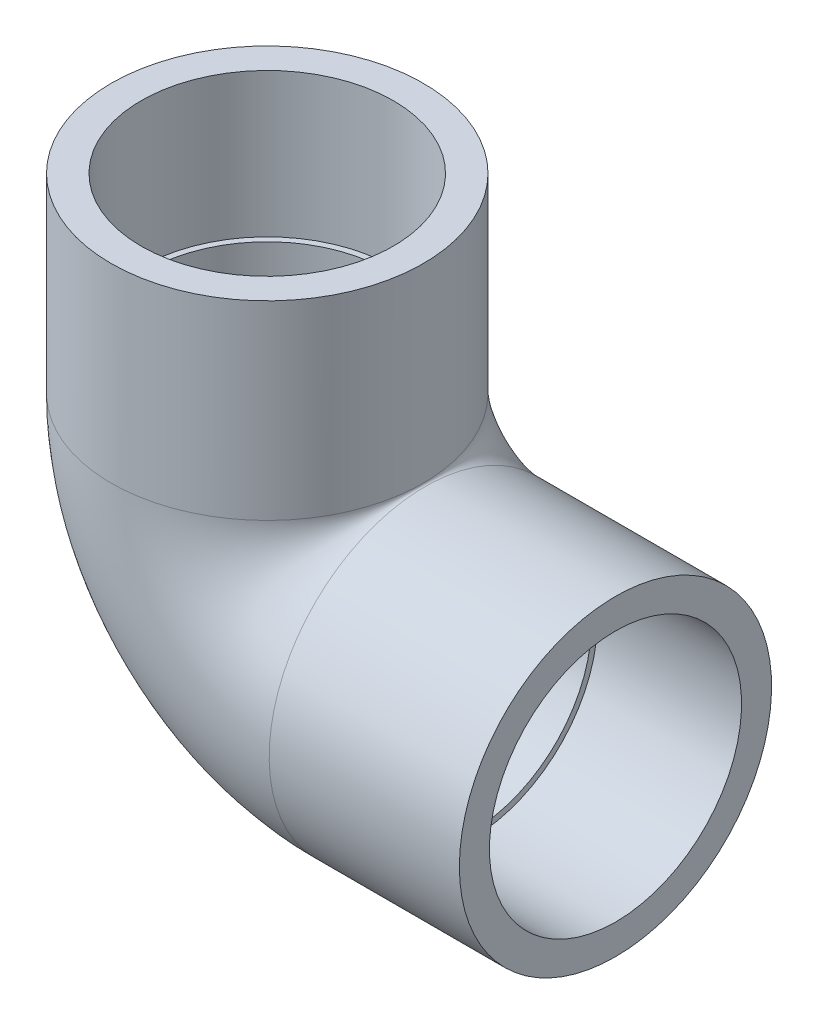
ISO-10303-21;
HEADER;
FILE_DESCRIPTION(('STEP AP214'),'2;1');
FILE_NAME('part.step','',(''),(''),'','','');
FILE_SCHEMA(('AUTOMOTIVE_DESIGN { 1 0 10303 214 1 1 1 1 }'));
ENDSEC;
DATA;
#1=APPLICATION_CONTEXT('core data for automotive mechanical design processes');
#2=APPLICATION_PROTOCOL_DEFINITION('international standard','automotive_design',2000,#1);
#3=PRODUCT_CONTEXT('',#1,'mechanical');
#4=PRODUCT('Part','Part','',(#3));
#5=PRODUCT_RELATED_PRODUCT_CATEGORY('part','',(#4));
#6=PRODUCT_DEFINITION_FORMATION('','',#4);
#7=PRODUCT_DEFINITION_CONTEXT('part definition',#1,'design');
#8=PRODUCT_DEFINITION('design','',#6,#7);
#9=PRODUCT_DEFINITION_SHAPE('','',#8);
#10=(LENGTH_UNIT() NAMED_UNIT(*) SI_UNIT(.MILLI.,.METRE.));
#11=(NAMED_UNIT(*) PLANE_ANGLE_UNIT() SI_UNIT($,.RADIAN.));
#12=(NAMED_UNIT(*) SI_UNIT($,.STERADIAN.) SOLID_ANGLE_UNIT());
#13=UNCERTAINTY_MEASURE_WITH_UNIT(LENGTH_MEASURE(1.E-05),#10,'distance_accuracy_value','');
#14=(GEOMETRIC_REPRESENTATION_CONTEXT(3) GLOBAL_UNCERTAINTY_ASSIGNED_CONTEXT((#13)) GLOBAL_UNIT_ASSIGNED_CONTEXT((#10,
#11,#12)) REPRESENTATION_CONTEXT('',''));
#15=CARTESIAN_POINT('',(0.,0.,0.));
#16=DIRECTION('',(0.,0.,1.));
#17=DIRECTION('',(1.,0.,0.));
#18=AXIS2_PLACEMENT_3D('',#15,#16,#17);
#19=CARTESIAN_POINT('',(0.,-25.146,0.));
#20=DIRECTION('',(0.,1.,0.));
#21=DIRECTION('',(-1.,0.,0.));
#22=AXIS2_PLACEMENT_3D('',#19,#20,#21);
#23=CYLINDRICAL_SURFACE('',#22,15.875);
#24=CARTESIAN_POINT('',(0.,-25.146,0.));
#25=DIRECTION('',(0.,1.,0.));
#26=DIRECTION('',(0.,0.,1.));
#27=AXIS2_PLACEMENT_3D('',#24,#25,#26);
#28=CIRCLE('',#27,15.875);
#29=CARTESIAN_POINT('',(-15.875,-25.146,0.));
#30=VERTEX_POINT('',#29);
#31=EDGE_CURVE('E56',#30,#30,#28,.T.);
#32=ORIENTED_EDGE('',*,*,#31,.F.);
#33=EDGE_LOOP('',(#32));
#34=FACE_BOUND('',#33,.T.);
#35=CARTESIAN_POINT('',(0.,-19.05,0.));
#36=DIRECTION('',(0.,1.,0.));
#37=DIRECTION('',(0.,0.,1.));
#38=AXIS2_PLACEMENT_3D('',#35,#36,#37);
#39=CIRCLE('',#38,15.875);
#40=CARTESIAN_POINT('',(0.,-19.05,15.875));
#41=VERTEX_POINT('',#40);
#42=EDGE_CURVE('E37',#41,#41,#39,.F.);
#43=ORIENTED_EDGE('',*,*,#42,.F.);
#44=EDGE_LOOP('',(#43));
#45=FACE_BOUND('',#44,.T.);
#46=ADVANCED_FACE('F33',(#34,#45),#23,.F.);
#47=CARTESIAN_POINT('',(20.8915,-46.0375,0.));
#48=DIRECTION('',(1.,0.,0.));
#49=DIRECTION('',(0.,0.,-1.));
#50=AXIS2_PLACEMENT_3D('',#47,#48,#49);
#51=CYLINDRICAL_SURFACE('',#50,15.875);
#52=CARTESIAN_POINT('',(20.8915,-46.0375,0.));
#53=DIRECTION('',(-1.,0.,0.));
#54=DIRECTION('',(0.,0.,1.));
#55=AXIS2_PLACEMENT_3D('',#52,#53,#54);
#56=CIRCLE('',#55,15.875);
#57=CARTESIAN_POINT('',(20.8915,-61.9125,0.));
#58=VERTEX_POINT('',#57);
#59=EDGE_CURVE('E46',#58,#58,#56,.T.);
#60=ORIENTED_EDGE('',*,*,#59,.T.);
#61=EDGE_LOOP('',(#60));
#62=FACE_BOUND('',#61,.T.);
#63=CARTESIAN_POINT('',(26.9875,-46.0375,0.));
#64=DIRECTION('',(1.,0.,0.));
#65=DIRECTION('',(0.,1.,0.));
#66=AXIS2_PLACEMENT_3D('',#63,#64,#65);
#67=CIRCLE('',#66,15.875);
#68=CARTESIAN_POINT('',(26.9875,-30.1625,0.));
#69=VERTEX_POINT('',#68);
#70=EDGE_CURVE('E49',#69,#69,#67,.T.);
#71=ORIENTED_EDGE('',*,*,#70,.T.);
#72=EDGE_LOOP('',(#71));
#73=FACE_BOUND('',#72,.T.);
#74=ADVANCED_FACE('F76',(#62,#73),#51,.F.);
#75=CARTESIAN_POINT('',(20.8915,-46.0375,0.));
#76=DIRECTION('',(1.,0.,0.));
#77=DIRECTION('',(0.,0.,-1.));
#78=AXIS2_PLACEMENT_3D('',#75,#76,#77);
#79=CYLINDRICAL_SURFACE('',#78,20.6375);
#80=CARTESIAN_POINT('',(20.8915,-46.0375,0.));
#81=DIRECTION('',(-1.,0.,0.));
#82=DIRECTION('',(0.,0.,1.));
#83=AXIS2_PLACEMENT_3D('',#80,#81,#82);
#84=CIRCLE('',#83,20.6375);
#85=CARTESIAN_POINT('',(20.8915,-66.675,0.));
#86=VERTEX_POINT('',#85);
#87=EDGE_CURVE('E41',#86,#86,#84,.T.);
#88=ORIENTED_EDGE('',*,*,#87,.F.);
#89=EDGE_LOOP('',(#88));
#90=FACE_BOUND('',#89,.T.);
#91=CARTESIAN_POINT('',(46.0375,-46.0375,0.));
#92=DIRECTION('',(-1.,0.,0.));
#93=DIRECTION('',(0.,0.,1.));
#94=AXIS2_PLACEMENT_3D('',#91,#92,#93);
#95=CIRCLE('',#94,20.6375);
#96=CARTESIAN_POINT('',(46.0375,-46.0375,20.6375));
#97=VERTEX_POINT('',#96);
#98=EDGE_CURVE('E10',#97,#97,#95,.T.);
#99=ORIENTED_EDGE('',*,*,#98,.T.);
#100=EDGE_LOOP('',(#99));
#101=FACE_BOUND('',#100,.T.);
#102=ADVANCED_FACE('F35',(#90,#101),#79,.T.);
#103=CARTESIAN_POINT('',(20.8915,-25.146,0.));
#104=DIRECTION('',(0.,0.,1.));
#105=DIRECTION('',(1.,0.,0.));
#106=AXIS2_PLACEMENT_3D('',#103,#104,#105);
#107=TOROIDAL_SURFACE('',#106,20.8915,20.6375);
#108=CARTESIAN_POINT('',(0.,-25.146,0.));
#109=DIRECTION('',(0.,1.,0.));
#110=DIRECTION('',(0.,0.,1.));
#111=AXIS2_PLACEMENT_3D('',#108,#109,#110);
#112=CIRCLE('',#111,20.6375);
#113=CARTESIAN_POINT('',(-20.6375,-25.146,0.));
#114=VERTEX_POINT('',#113);
#115=EDGE_CURVE('E71',#114,#114,#112,.T.);
#116=CARTESIAN_POINT('',(20.8915,-25.146,0.));
#117=DIRECTION('',(0.,0.,1.));
#118=DIRECTION('',(1.,0.,0.));
#119=AXIS2_PLACEMENT_3D('',#116,#117,#118);
#120=CIRCLE('',#119,41.529);
#121=EDGE_CURVE('',#114,#86,#120,.T.);
#122=ORIENTED_EDGE('',*,*,#115,.F.);
#123=ORIENTED_EDGE('',*,*,#87,.T.);
#124=ORIENTED_EDGE('',*,*,#121,.T.);
#125=ORIENTED_EDGE('',*,*,#121,.F.);
#126=EDGE_LOOP('',(#122,#124,#123,#125));
#127=FACE_BOUND('',#126,.T.);
#128=ADVANCED_FACE('F81',(#127),#107,.T.);
#129=CARTESIAN_POINT('',(20.8915,-25.146,0.));
#130=DIRECTION('',(0.,0.,1.));
#131=DIRECTION('',(1.,0.,0.));
#132=AXIS2_PLACEMENT_3D('',#129,#130,#131);
#133=TOROIDAL_SURFACE('',#132,20.8915,15.875);
#134=CARTESIAN_POINT('',(20.8915,-25.146,0.));
#135=DIRECTION('',(0.,0.,1.));
#136=DIRECTION('',(1.,0.,0.));
#137=AXIS2_PLACEMENT_3D('',#134,#135,#136);
#138=CIRCLE('',#137,36.7665);
#139=EDGE_CURVE('',#30,#58,#138,.T.);
#140=ORIENTED_EDGE('',*,*,#31,.T.);
#141=ORIENTED_EDGE('',*,*,#59,.F.);
#142=ORIENTED_EDGE('',*,*,#139,.T.);
#143=ORIENTED_EDGE('',*,*,#139,.F.);
#144=EDGE_LOOP('',(#140,#142,#141,#143));
#145=FACE_BOUND('',#144,.T.);
#146=ADVANCED_FACE('F78',(#145),#133,.F.);
#147=CARTESIAN_POINT('',(0.,-25.146,0.));
#148=DIRECTION('',(0.,1.,0.));
#149=DIRECTION('',(-1.,0.,0.));
#150=AXIS2_PLACEMENT_3D('',#147,#148,#149);
#151=CYLINDRICAL_SURFACE('',#150,20.6375);
#152=ORIENTED_EDGE('',*,*,#115,.T.);
#153=EDGE_LOOP('',(#152));
#154=FACE_BOUND('',#153,.T.);
#155=CARTESIAN_POINT('',(0.,0.,0.));
#156=DIRECTION('',(0.,1.,0.));
#157=DIRECTION('',(0.,0.,1.));
#158=AXIS2_PLACEMENT_3D('',#155,#156,#157);
#159=CIRCLE('',#158,20.6375);
#160=CARTESIAN_POINT('',(0.,0.,20.6375));
#161=VERTEX_POINT('',#160);
#162=EDGE_CURVE('E51',#161,#161,#159,.T.);
#163=ORIENTED_EDGE('',*,*,#162,.F.);
#164=EDGE_LOOP('',(#163));
#165=FACE_BOUND('',#164,.T.);
#166=ADVANCED_FACE('F80',(#154,#165),#151,.T.);
#167=CARTESIAN_POINT('',(46.0375,-46.0375,0.));
#168=DIRECTION('',(-1.,0.,0.));
#169=DIRECTION('',(0.,0.,1.));
#170=AXIS2_PLACEMENT_3D('',#167,#168,#169);
#171=PLANE('',#170);
#172=CARTESIAN_POINT('',(46.0375,-46.0375,0.));
#173=DIRECTION('',(1.,0.,0.));
#174=DIRECTION('',(0.,1.,0.));
#175=AXIS2_PLACEMENT_3D('',#172,#173,#174);
#176=CIRCLE('',#175,16.66875);
#177=CARTESIAN_POINT('',(46.0375,-29.36875,0.));
#178=VERTEX_POINT('',#177);
#179=EDGE_CURVE('E59',#178,#178,#176,.T.);
#180=ORIENTED_EDGE('',*,*,#179,.F.);
#181=EDGE_LOOP('',(#180));
#182=FACE_BOUND('',#181,.T.);
#183=ORIENTED_EDGE('',*,*,#98,.F.);
#184=EDGE_LOOP('',(#183));
#185=FACE_BOUND('',#184,.T.);
#186=ADVANCED_FACE('F88',(#182,#185),#171,.F.);
#187=CARTESIAN_POINT('',(0.,0.,0.));
#188=DIRECTION('',(0.,1.,0.));
#189=DIRECTION('',(0.,0.,1.));
#190=AXIS2_PLACEMENT_3D('',#187,#188,#189);
#191=PLANE('',#190);
#192=CARTESIAN_POINT('',(0.,0.,0.));
#193=DIRECTION('',(0.,1.,0.));
#194=DIRECTION('',(0.,0.,1.));
#195=AXIS2_PLACEMENT_3D('',#192,#193,#194);
#196=CIRCLE('',#195,16.66875);
#197=CARTESIAN_POINT('',(0.,0.,16.66875));
#198=VERTEX_POINT('',#197);
#199=EDGE_CURVE('E66',#198,#198,#196,.T.);
#200=ORIENTED_EDGE('',*,*,#199,.F.);
#201=EDGE_LOOP('',(#200));
#202=FACE_BOUND('',#201,.T.);
#203=ORIENTED_EDGE('',*,*,#162,.T.);
#204=EDGE_LOOP('',(#203));
#205=FACE_BOUND('',#204,.T.);
#206=ADVANCED_FACE('F102',(#202,#205),#191,.T.);
#207=CARTESIAN_POINT('',(26.9875,-46.0375,0.));
#208=DIRECTION('',(1.,0.,0.));
#209=DIRECTION('',(0.,1.,0.));
#210=AXIS2_PLACEMENT_3D('',#207,#208,#209);
#211=CYLINDRICAL_SURFACE('',#210,16.66875);
#212=CARTESIAN_POINT('',(26.9875,-46.0375,0.));
#213=DIRECTION('',(1.,0.,0.));
#214=DIRECTION('',(0.,1.,0.));
#215=AXIS2_PLACEMENT_3D('',#212,#213,#214);
#216=CIRCLE('',#215,16.66875);
#217=CARTESIAN_POINT('',(26.9875,-29.36875,0.));
#218=VERTEX_POINT('',#217);
#219=EDGE_CURVE('E52',#218,#218,#216,.T.);
#220=CARTESIAN_POINT('',(26.9875,-29.36875,0.));
#221=CARTESIAN_POINT('',(27.1859375,-29.36875,0.));
#222=CARTESIAN_POINT('',(27.384375,-29.36875,0.));
#223=CARTESIAN_POINT('',(27.78125,-29.36875,0.));
#224=CARTESIAN_POINT('',(27.9796875,-29.36875,0.));
#225=CARTESIAN_POINT('',(28.3765625,-29.36875,0.));
#226=CARTESIAN_POINT('',(28.575,-29.36875,0.));
#227=CARTESIAN_POINT('',(28.971875,-29.36875,0.));
#228=CARTESIAN_POINT('',(29.1703125,-29.36875,0.));
#229=CARTESIAN_POINT('',(29.5671875,-29.36875,0.));
#230=CARTESIAN_POINT('',(29.765625,-29.36875,0.));
#231=CARTESIAN_POINT('',(30.1625,-29.36875,0.));
#232=CARTESIAN_POINT('',(30.3609375,-29.36875,0.));
#233=CARTESIAN_POINT('',(30.7578125,-29.36875,0.));
#234=CARTESIAN_POINT('',(30.95625,-29.36875,0.));
#235=CARTESIAN_POINT('',(31.353125,-29.36875,0.));
#236=CARTESIAN_POINT('',(31.5515625,-29.36875,0.));
#237=CARTESIAN_POINT('',(31.9484375,-29.36875,0.));
#238=CARTESIAN_POINT('',(32.146875,-29.36875,0.));
#239=CARTESIAN_POINT('',(32.54375,-29.36875,0.));
#240=CARTESIAN_POINT('',(32.7421875,-29.36875,0.));
#241=CARTESIAN_POINT('',(33.1390625,-29.36875,0.));
#242=CARTESIAN_POINT('',(33.3375,-29.36875,0.));
#243=CARTESIAN_POINT('',(33.734375,-29.36875,0.));
#244=CARTESIAN_POINT('',(33.9328125,-29.36875,0.));
#245=CARTESIAN_POINT('',(34.3296875,-29.36875,0.));
#246=CARTESIAN_POINT('',(34.528125,-29.36875,0.));
#247=CARTESIAN_POINT('',(34.925,-29.36875,0.));
#248=CARTESIAN_POINT('',(35.1234375,-29.36875,0.));
#249=CARTESIAN_POINT('',(35.5203125,-29.36875,0.));
#250=CARTESIAN_POINT('',(35.71875,-29.36875,0.));
#251=CARTESIAN_POINT('',(36.115625,-29.36875,0.));
#252=CARTESIAN_POINT('',(36.3140625,-29.36875,0.));
#253=CARTESIAN_POINT('',(36.7109375,-29.36875,0.));
#254=CARTESIAN_POINT('',(36.909375,-29.36875,0.));
#255=CARTESIAN_POINT('',(37.30625,-29.36875,0.));
#256=CARTESIAN_POINT('',(37.5046875,-29.36875,0.));
#257=CARTESIAN_POINT('',(37.9015625,-29.36875,0.));
#258=CARTESIAN_POINT('',(38.1,-29.36875,0.));
#259=CARTESIAN_POINT('',(38.496875,-29.36875,0.));
#260=CARTESIAN_POINT('',(38.6953125,-29.36875,0.));
#261=CARTESIAN_POINT('',(39.0921875,-29.36875,0.));
#262=CARTESIAN_POINT('',(39.290625,-29.36875,0.));
#263=CARTESIAN_POINT('',(39.6875,-29.36875,0.));
#264=CARTESIAN_POINT('',(39.8859375,-29.36875,0.));
#265=CARTESIAN_POINT('',(40.2828125,-29.36875,0.));
#266=CARTESIAN_POINT('',(40.48125,-29.36875,0.));
#267=CARTESIAN_POINT('',(40.878125,-29.36875,0.));
#268=CARTESIAN_POINT('',(41.0765625,-29.36875,0.));
#269=CARTESIAN_POINT('',(41.4734375,-29.36875,0.));
#270=CARTESIAN_POINT('',(41.671875,-29.36875,0.));
#271=CARTESIAN_POINT('',(42.06875,-29.36875,0.));
#272=CARTESIAN_POINT('',(42.2671875,-29.36875,0.));
#273=CARTESIAN_POINT('',(42.6640625,-29.36875,0.));
#274=CARTESIAN_POINT('',(42.8625,-29.36875,0.));
#275=CARTESIAN_POINT('',(43.259375,-29.36875,0.));
#276=CARTESIAN_POINT('',(43.4578125,-29.36875,0.));
#277=CARTESIAN_POINT('',(43.8546875,-29.36875,0.));
#278=CARTESIAN_POINT('',(44.053125,-29.36875,0.));
#279=CARTESIAN_POINT('',(44.45,-29.36875,0.));
#280=CARTESIAN_POINT('',(44.6484375,-29.36875,0.));
#281=CARTESIAN_POINT('',(45.0453125,-29.36875,0.));
#282=CARTESIAN_POINT('',(45.24375,-29.36875,0.));
#283=CARTESIAN_POINT('',(45.640625,-29.36875,0.));
#284=CARTESIAN_POINT('',(45.8390625,-29.36875,0.));
#285=CARTESIAN_POINT('',(46.0375,-29.36875,0.));
#286=B_SPLINE_CURVE_WITH_KNOTS('',3,(#220,#221,#222,#223,#224,#225,#226,#227,#228,#229,#230,
#231,#232,#233,#234,#235,#236,#237,#238,#239,#240,#241,#242,#243,#244,#245,#246,#247,#248,#249,
#250,#251,#252,#253,#254,#255,#256,#257,#258,#259,#260,#261,#262,#263,#264,#265,#266,#267,#268,
#269,#270,#271,#272,#273,#274,#275,#276,#277,#278,#279,#280,#281,#282,#283,#284,#285),
.UNSPECIFIED.,.F.,.F.,(4,2,2,2,2,2,2,2,2,2,2,2,2,2,2,2,2,2,2,2,2,2,2,2,2,2,2,2,2,2,2,2,4),(0.,
0.5953125,1.190625,1.7859375,2.38125,2.9765625,3.571875,4.1671875,4.76250000000001,
5.35781250000001,5.95312500000001,6.54843750000001,7.14375000000001,7.73906250000001,
8.33437500000001,8.92968750000001,9.52500000000001,10.1203125,10.715625,11.3109375,11.90625,
12.5015625,13.096875,13.6921875,14.2875,14.8828125,15.478125,16.0734375,16.66875,17.2640625,
17.859375,18.4546875,19.05),.UNSPECIFIED.);
#287=EDGE_CURVE('BSEAM105',#218,#178,#286,.T.);
#288=ORIENTED_EDGE('',*,*,#219,.F.);
#289=ORIENTED_EDGE('',*,*,#179,.T.);
#290=ORIENTED_EDGE('',*,*,#287,.T.);
#291=ORIENTED_EDGE('',*,*,#287,.F.);
#292=EDGE_LOOP('',(#288,#290,#289,#291));
#293=FACE_BOUND('',#292,.T.);
#294=ADVANCED_FACE('F105',(#293),#211,.F.);
#295=CARTESIAN_POINT('',(26.9875,-46.0375,0.));
#296=DIRECTION('',(1.,0.,0.));
#297=DIRECTION('',(0.,1.,0.));
#298=AXIS2_PLACEMENT_3D('',#295,#296,#297);
#299=PLANE('',#298);
#300=ORIENTED_EDGE('',*,*,#70,.F.);
#301=EDGE_LOOP('',(#300));
#302=FACE_BOUND('',#301,.T.);
#303=ORIENTED_EDGE('',*,*,#219,.T.);
#304=EDGE_LOOP('',(#303));
#305=FACE_BOUND('',#304,.T.);
#306=ADVANCED_FACE('F112',(#302,#305),#299,.T.);
#307=CARTESIAN_POINT('',(0.,-19.05,0.));
#308=DIRECTION('',(0.,1.,0.));
#309=DIRECTION('',(0.,0.,1.));
#310=AXIS2_PLACEMENT_3D('',#307,#308,#309);
#311=PLANE('',#310);
#312=CARTESIAN_POINT('',(0.,-19.05,0.));
#313=DIRECTION('',(0.,1.,0.));
#314=DIRECTION('',(0.,0.,1.));
#315=AXIS2_PLACEMENT_3D('',#312,#313,#314);
#316=CIRCLE('',#315,16.66875);
#317=CARTESIAN_POINT('',(0.,-19.05,16.66875));
#318=VERTEX_POINT('',#317);
#319=EDGE_CURVE('E129',#318,#318,#316,.T.);
#320=ORIENTED_EDGE('',*,*,#319,.T.);
#321=EDGE_LOOP('',(#320));
#322=FACE_BOUND('',#321,.T.);
#323=ORIENTED_EDGE('',*,*,#42,.T.);
#324=EDGE_LOOP('',(#323));
#325=FACE_BOUND('',#324,.T.);
#326=ADVANCED_FACE('F116',(#322,#325),#311,.T.);
#327=CARTESIAN_POINT('',(0.,-19.05,0.));
#328=DIRECTION('',(0.,1.,0.));
#329=DIRECTION('',(0.,0.,1.));
#330=AXIS2_PLACEMENT_3D('',#327,#328,#329);
#331=CYLINDRICAL_SURFACE('',#330,16.66875);
#332=CARTESIAN_POINT('',(0.,-19.05,16.66875));
#333=CARTESIAN_POINT('',(0.,-18.8515625,16.66875));
#334=CARTESIAN_POINT('',(0.,-18.653125,16.66875));
#335=CARTESIAN_POINT('',(0.,-18.25625,16.66875));
#336=CARTESIAN_POINT('',(0.,-18.0578125,16.66875));
#337=CARTESIAN_POINT('',(0.,-17.6609375,16.66875));
#338=CARTESIAN_POINT('',(0.,-17.4625,16.66875));
#339=CARTESIAN_POINT('',(0.,-17.065625,16.66875));
#340=CARTESIAN_POINT('',(0.,-16.8671875,16.66875));
#341=CARTESIAN_POINT('',(0.,-16.4703125,16.66875));
#342=CARTESIAN_POINT('',(0.,-16.271875,16.66875));
#343=CARTESIAN_POINT('',(0.,-15.875,16.66875));
#344=CARTESIAN_POINT('',(0.,-15.6765625,16.66875));
#345=CARTESIAN_POINT('',(0.,-15.2796875,16.66875));
#346=CARTESIAN_POINT('',(0.,-15.08125,16.66875));
#347=CARTESIAN_POINT('',(0.,-14.684375,16.66875));
#348=CARTESIAN_POINT('',(0.,-14.4859375,16.66875));
#349=CARTESIAN_POINT('',(0.,-14.0890625,16.66875));
#350=CARTESIAN_POINT('',(0.,-13.890625,16.66875));
#351=CARTESIAN_POINT('',(0.,-13.49375,16.66875));
#352=CARTESIAN_POINT('',(0.,-13.2953125,16.66875));
#353=CARTESIAN_POINT('',(0.,-12.8984375,16.66875));
#354=CARTESIAN_POINT('',(0.,-12.7,16.66875));
#355=CARTESIAN_POINT('',(0.,-12.303125,16.66875));
#356=CARTESIAN_POINT('',(0.,-12.1046875,16.66875));
#357=CARTESIAN_POINT('',(0.,-11.7078125,16.66875));
#358=CARTESIAN_POINT('',(0.,-11.509375,16.66875));
#359=CARTESIAN_POINT('',(0.,-11.1125,16.66875));
#360=CARTESIAN_POINT('',(0.,-10.9140625,16.66875));
#361=CARTESIAN_POINT('',(0.,-10.5171875,16.66875));
#362=CARTESIAN_POINT('',(0.,-10.31875,16.66875));
#363=CARTESIAN_POINT('',(0.,-9.921875,16.66875));
#364=CARTESIAN_POINT('',(0.,-9.7234375,16.66875));
#365=CARTESIAN_POINT('',(0.,-9.3265625,16.66875));
#366=CARTESIAN_POINT('',(0.,-9.128125,16.66875));
#367=CARTESIAN_POINT('',(0.,-8.73125,16.66875));
#368=CARTESIAN_POINT('',(0.,-8.5328125,16.66875));
#369=CARTESIAN_POINT('',(0.,-8.1359375,16.66875));
#370=CARTESIAN_POINT('',(0.,-7.9375,16.66875));
#371=CARTESIAN_POINT('',(0.,-7.540625,16.66875));
#372=CARTESIAN_POINT('',(0.,-7.3421875,16.66875));
#373=CARTESIAN_POINT('',(0.,-6.9453125,16.66875));
#374=CARTESIAN_POINT('',(0.,-6.746875,16.66875));
#375=CARTESIAN_POINT('',(0.,-6.35,16.66875));
#376=CARTESIAN_POINT('',(0.,-6.1515625,16.66875));
#377=CARTESIAN_POINT('',(0.,-5.7546875,16.66875));
#378=CARTESIAN_POINT('',(0.,-5.55625,16.66875));
#379=CARTESIAN_POINT('',(0.,-5.159375,16.66875));
#380=CARTESIAN_POINT('',(0.,-4.9609375,16.66875));
#381=CARTESIAN_POINT('',(0.,-4.5640625,16.66875));
#382=CARTESIAN_POINT('',(0.,-4.365625,16.66875));
#383=CARTESIAN_POINT('',(0.,-3.96875,16.66875));
#384=CARTESIAN_POINT('',(0.,-3.7703125,16.66875));
#385=CARTESIAN_POINT('',(0.,-3.3734375,16.66875));
#386=CARTESIAN_POINT('',(0.,-3.175,16.66875));
#387=CARTESIAN_POINT('',(0.,-2.778125,16.66875));
#388=CARTESIAN_POINT('',(0.,-2.5796875,16.66875));
#389=CARTESIAN_POINT('',(0.,-2.1828125,16.66875));
#390=CARTESIAN_POINT('',(0.,-1.984375,16.66875));
#391=CARTESIAN_POINT('',(0.,-1.5875,16.66875));
#392=CARTESIAN_POINT('',(0.,-1.3890625,16.66875));
#393=CARTESIAN_POINT('',(0.,-0.992187500000001,16.66875));
#394=CARTESIAN_POINT('',(0.,-0.793750000000001,16.66875));
#395=CARTESIAN_POINT('',(0.,-0.396875,16.66875));
#396=CARTESIAN_POINT('',(0.,-0.1984375,16.66875));
#397=CARTESIAN_POINT('',(0.,0.,16.66875));
#398=B_SPLINE_CURVE_WITH_KNOTS('',3,(#332,#333,#334,#335,#336,#337,#338,#339,#340,#341,#342,
#343,#344,#345,#346,#347,#348,#349,#350,#351,#352,#353,#354,#355,#356,#357,#358,#359,#360,#361,
#362,#363,#364,#365,#366,#367,#368,#369,#370,#371,#372,#373,#374,#375,#376,#377,#378,#379,#380,
#381,#382,#383,#384,#385,#386,#387,#388,#389,#390,#391,#392,#393,#394,#395,#396,#397),
.UNSPECIFIED.,.F.,.F.,(4,2,2,2,2,2,2,2,2,2,2,2,2,2,2,2,2,2,2,2,2,2,2,2,2,2,2,2,2,2,2,2,4),(0.,
0.5953125,1.190625,1.7859375,2.38125,2.9765625,3.571875,4.1671875,4.7625,5.3578125,5.953125,
6.5484375,7.14375,7.7390625,8.334375,8.9296875,9.525,10.1203125,10.715625,11.3109375,11.90625,
12.5015625,13.096875,13.6921875,14.2875,14.8828125,15.478125,16.0734375,16.66875,17.2640625,
17.859375,18.4546875,19.05),.UNSPECIFIED.);
#399=EDGE_CURVE('BSEAM118',#318,#198,#398,.T.);
#400=ORIENTED_EDGE('',*,*,#319,.F.);
#401=ORIENTED_EDGE('',*,*,#199,.T.);
#402=ORIENTED_EDGE('',*,*,#399,.T.);
#403=ORIENTED_EDGE('',*,*,#399,.F.);
#404=EDGE_LOOP('',(#400,#402,#401,#403));
#405=FACE_BOUND('',#404,.T.);
#406=ADVANCED_FACE('F118',(#405),#331,.F.);
#407=CLOSED_SHELL('',(#46,#74,#102,#128,#146,#166,#186,#206,#294,#306,#326,#406));
#408=MANIFOLD_SOLID_BREP('B2',#407);
#409=ADVANCED_BREP_SHAPE_REPRESENTATION('',(#18,#408),#14);
#410=SHAPE_DEFINITION_REPRESENTATION(#9,#409);
ENDSEC;
END-ISO-10303-21;
